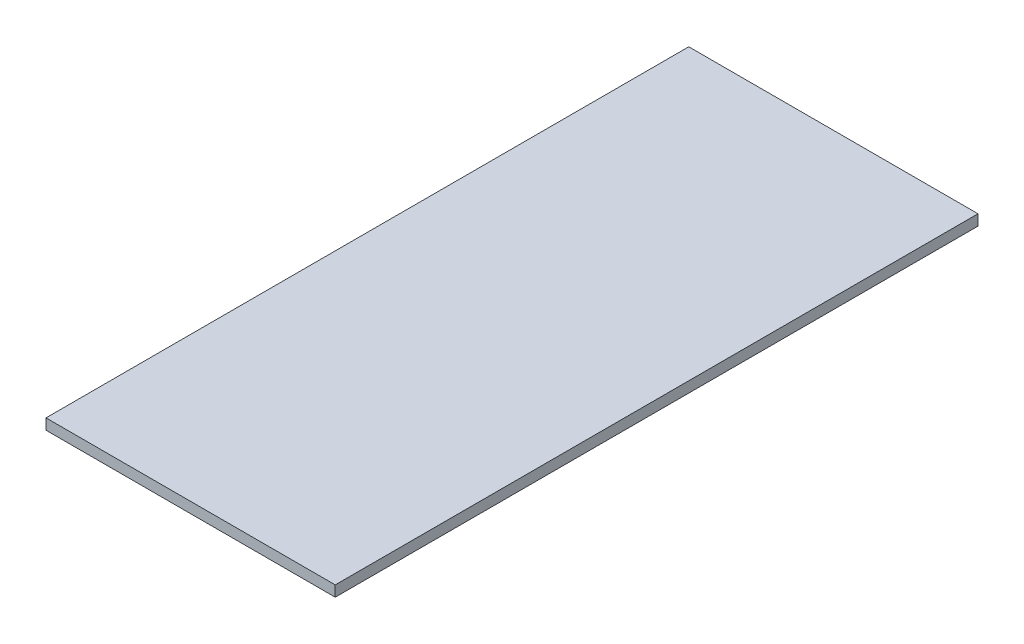
ISO-10303-21;
HEADER;
FILE_DESCRIPTION(('STEP AP214'),'2;1');
FILE_NAME('part.step','',(''),(''),'','','');
FILE_SCHEMA(('AUTOMOTIVE_DESIGN { 1 0 10303 214 1 1 1 1 }'));
ENDSEC;
DATA;
#1=APPLICATION_CONTEXT('core data for automotive mechanical design processes');
#2=APPLICATION_PROTOCOL_DEFINITION('international standard','automotive_design',2000,#1);
#3=PRODUCT_CONTEXT('',#1,'mechanical');
#4=PRODUCT('Part','Part','',(#3));
#5=PRODUCT_RELATED_PRODUCT_CATEGORY('part','',(#4));
#6=PRODUCT_DEFINITION_FORMATION('','',#4);
#7=PRODUCT_DEFINITION_CONTEXT('part definition',#1,'design');
#8=PRODUCT_DEFINITION('design','',#6,#7);
#9=PRODUCT_DEFINITION_SHAPE('','',#8);
#10=(LENGTH_UNIT() NAMED_UNIT(*) SI_UNIT(.MILLI.,.METRE.));
#11=(NAMED_UNIT(*) PLANE_ANGLE_UNIT() SI_UNIT($,.RADIAN.));
#12=(NAMED_UNIT(*) SI_UNIT($,.STERADIAN.) SOLID_ANGLE_UNIT());
#13=UNCERTAINTY_MEASURE_WITH_UNIT(LENGTH_MEASURE(1.E-05),#10,'distance_accuracy_value','');
#14=(GEOMETRIC_REPRESENTATION_CONTEXT(3) GLOBAL_UNCERTAINTY_ASSIGNED_CONTEXT((#13)) GLOBAL_UNIT_ASSIGNED_CONTEXT((#10,
#11,#12)) REPRESENTATION_CONTEXT('',''));
#15=CARTESIAN_POINT('',(0.,0.,0.));
#16=DIRECTION('',(0.,0.,1.));
#17=DIRECTION('',(1.,0.,0.));
#18=AXIS2_PLACEMENT_3D('',#15,#16,#17);
#19=CARTESIAN_POINT('',(40.5,3.,-90.));
#20=DIRECTION('',(-1.,0.,0.));
#21=DIRECTION('',(0.,0.,1.));
#22=AXIS2_PLACEMENT_3D('',#19,#20,#21);
#23=PLANE('',#22);
#24=DIRECTION('',(0.,0.,-1.));
#25=VECTOR('',#24,1.);
#26=CARTESIAN_POINT('',(40.5,0.,-90.));
#27=LINE('',#26,#25);
#28=CARTESIAN_POINT('',(40.5,0.,90.));
#29=VERTEX_POINT('',#28);
#30=CARTESIAN_POINT('',(40.5,0.,-90.));
#31=VERTEX_POINT('',#30);
#32=EDGE_CURVE('E107',#29,#31,#27,.T.);
#33=ORIENTED_EDGE('',*,*,#32,.T.);
#34=DIRECTION('',(0.,-1.,0.));
#35=VECTOR('',#34,1.);
#36=CARTESIAN_POINT('',(40.5,3.,-90.));
#37=LINE('',#36,#35);
#38=CARTESIAN_POINT('',(40.5,3.,-90.));
#39=VERTEX_POINT('',#38);
#40=EDGE_CURVE('E11',#39,#31,#37,.T.);
#41=ORIENTED_EDGE('',*,*,#40,.F.);
#42=DIRECTION('',(0.,0.,-1.));
#43=VECTOR('',#42,1.);
#44=CARTESIAN_POINT('',(40.5,3.,-90.));
#45=LINE('',#44,#43);
#46=CARTESIAN_POINT('',(40.5,3.,90.));
#47=VERTEX_POINT('',#46);
#48=EDGE_CURVE('E91',#47,#39,#45,.T.);
#49=ORIENTED_EDGE('',*,*,#48,.F.);
#50=DIRECTION('',(0.,-1.,0.));
#51=VECTOR('',#50,1.);
#52=CARTESIAN_POINT('',(40.5,3.,90.));
#53=LINE('',#52,#51);
#54=EDGE_CURVE('E103',#47,#29,#53,.T.);
#55=ORIENTED_EDGE('',*,*,#54,.T.);
#56=EDGE_LOOP('',(#33,#41,#49,#55));
#57=FACE_BOUND('',#56,.T.);
#58=ADVANCED_FACE('F39',(#57),#23,.F.);
#59=CARTESIAN_POINT('',(-40.5,3.,-90.));
#60=DIRECTION('',(0.,0.,1.));
#61=DIRECTION('',(1.,0.,0.));
#62=AXIS2_PLACEMENT_3D('',#59,#60,#61);
#63=PLANE('',#62);
#64=DIRECTION('',(-1.,0.,0.));
#65=VECTOR('',#64,1.);
#66=CARTESIAN_POINT('',(-40.5,0.,-90.));
#67=LINE('',#66,#65);
#68=CARTESIAN_POINT('',(-40.5,0.,-90.));
#69=VERTEX_POINT('',#68);
#70=EDGE_CURVE('E96',#31,#69,#67,.T.);
#71=ORIENTED_EDGE('',*,*,#70,.T.);
#72=DIRECTION('',(0.,-1.,0.));
#73=VECTOR('',#72,1.);
#74=CARTESIAN_POINT('',(-40.5,3.,-90.));
#75=LINE('',#74,#73);
#76=CARTESIAN_POINT('',(-40.5,3.,-90.));
#77=VERTEX_POINT('',#76);
#78=EDGE_CURVE('E48',#77,#69,#75,.T.);
#79=ORIENTED_EDGE('',*,*,#78,.F.);
#80=DIRECTION('',(-1.,0.,0.));
#81=VECTOR('',#80,1.);
#82=CARTESIAN_POINT('',(-40.5,3.,-90.));
#83=LINE('',#82,#81);
#84=EDGE_CURVE('E86',#39,#77,#83,.T.);
#85=ORIENTED_EDGE('',*,*,#84,.F.);
#86=ORIENTED_EDGE('',*,*,#40,.T.);
#87=EDGE_LOOP('',(#71,#79,#85,#86));
#88=FACE_BOUND('',#87,.T.);
#89=ADVANCED_FACE('F95',(#88),#63,.F.);
#90=CARTESIAN_POINT('',(-40.5,3.,-90.));
#91=DIRECTION('',(1.,0.,0.));
#92=DIRECTION('',(0.,0.,-1.));
#93=AXIS2_PLACEMENT_3D('',#90,#91,#92);
#94=PLANE('',#93);
#95=DIRECTION('',(0.,0.,1.));
#96=VECTOR('',#95,1.);
#97=CARTESIAN_POINT('',(-40.5,0.,-90.));
#98=LINE('',#97,#96);
#99=CARTESIAN_POINT('',(-40.5,0.,90.));
#100=VERTEX_POINT('',#99);
#101=EDGE_CURVE('E73',#69,#100,#98,.T.);
#102=ORIENTED_EDGE('',*,*,#101,.T.);
#103=DIRECTION('',(0.,-1.,0.));
#104=VECTOR('',#103,1.);
#105=CARTESIAN_POINT('',(-40.5,3.,90.));
#106=LINE('',#105,#104);
#107=CARTESIAN_POINT('',(-40.5,3.,90.));
#108=VERTEX_POINT('',#107);
#109=EDGE_CURVE('E98',#108,#100,#106,.T.);
#110=ORIENTED_EDGE('',*,*,#109,.F.);
#111=DIRECTION('',(0.,0.,1.));
#112=VECTOR('',#111,1.);
#113=CARTESIAN_POINT('',(-40.5,3.,-90.));
#114=LINE('',#113,#112);
#115=EDGE_CURVE('E89',#77,#108,#114,.T.);
#116=ORIENTED_EDGE('',*,*,#115,.F.);
#117=ORIENTED_EDGE('',*,*,#78,.T.);
#118=EDGE_LOOP('',(#102,#110,#116,#117));
#119=FACE_BOUND('',#118,.T.);
#120=ADVANCED_FACE('F99',(#119),#94,.F.);
#121=CARTESIAN_POINT('',(-40.5,3.,90.));
#122=DIRECTION('',(0.,0.,-1.));
#123=DIRECTION('',(-1.,0.,0.));
#124=AXIS2_PLACEMENT_3D('',#121,#122,#123);
#125=PLANE('',#124);
#126=DIRECTION('',(1.,0.,0.));
#127=VECTOR('',#126,1.);
#128=CARTESIAN_POINT('',(-40.5,0.,90.));
#129=LINE('',#128,#127);
#130=EDGE_CURVE('E79',#100,#29,#129,.T.);
#131=ORIENTED_EDGE('',*,*,#130,.T.);
#132=ORIENTED_EDGE('',*,*,#54,.F.);
#133=DIRECTION('',(1.,0.,0.));
#134=VECTOR('',#133,1.);
#135=CARTESIAN_POINT('',(-40.5,3.,90.));
#136=LINE('',#135,#134);
#137=EDGE_CURVE('E56',#108,#47,#136,.T.);
#138=ORIENTED_EDGE('',*,*,#137,.F.);
#139=ORIENTED_EDGE('',*,*,#109,.T.);
#140=EDGE_LOOP('',(#131,#132,#138,#139));
#141=FACE_BOUND('',#140,.T.);
#142=ADVANCED_FACE('F120',(#141),#125,.F.);
#143=CARTESIAN_POINT('',(0.,3.,0.));
#144=DIRECTION('',(0.,1.,0.));
#145=DIRECTION('',(0.,0.,1.));
#146=AXIS2_PLACEMENT_3D('',#143,#144,#145);
#147=PLANE('',#146);
#148=ORIENTED_EDGE('',*,*,#48,.T.);
#149=ORIENTED_EDGE('',*,*,#84,.T.);
#150=ORIENTED_EDGE('',*,*,#115,.T.);
#151=ORIENTED_EDGE('',*,*,#137,.T.);
#152=EDGE_LOOP('',(#148,#149,#150,#151));
#153=FACE_BOUND('',#152,.T.);
#154=ADVANCED_FACE('F87',(#153),#147,.T.);
#155=CARTESIAN_POINT('',(0.,0.,0.));
#156=DIRECTION('',(0.,1.,0.));
#157=DIRECTION('',(0.,0.,1.));
#158=AXIS2_PLACEMENT_3D('',#155,#156,#157);
#159=PLANE('',#158);
#160=ORIENTED_EDGE('',*,*,#32,.F.);
#161=ORIENTED_EDGE('',*,*,#130,.F.);
#162=ORIENTED_EDGE('',*,*,#101,.F.);
#163=ORIENTED_EDGE('',*,*,#70,.F.);
#164=EDGE_LOOP('',(#160,#161,#162,#163));
#165=FACE_BOUND('',#164,.T.);
#166=ADVANCED_FACE('F123',(#165),#159,.F.);
#167=CLOSED_SHELL('',(#58,#89,#120,#142,#154,#166));
#168=MANIFOLD_SOLID_BREP('B2',#167);
#169=ADVANCED_BREP_SHAPE_REPRESENTATION('',(#18,#168),#14);
#170=SHAPE_DEFINITION_REPRESENTATION(#9,#169);
ENDSEC;
END-ISO-10303-21;
